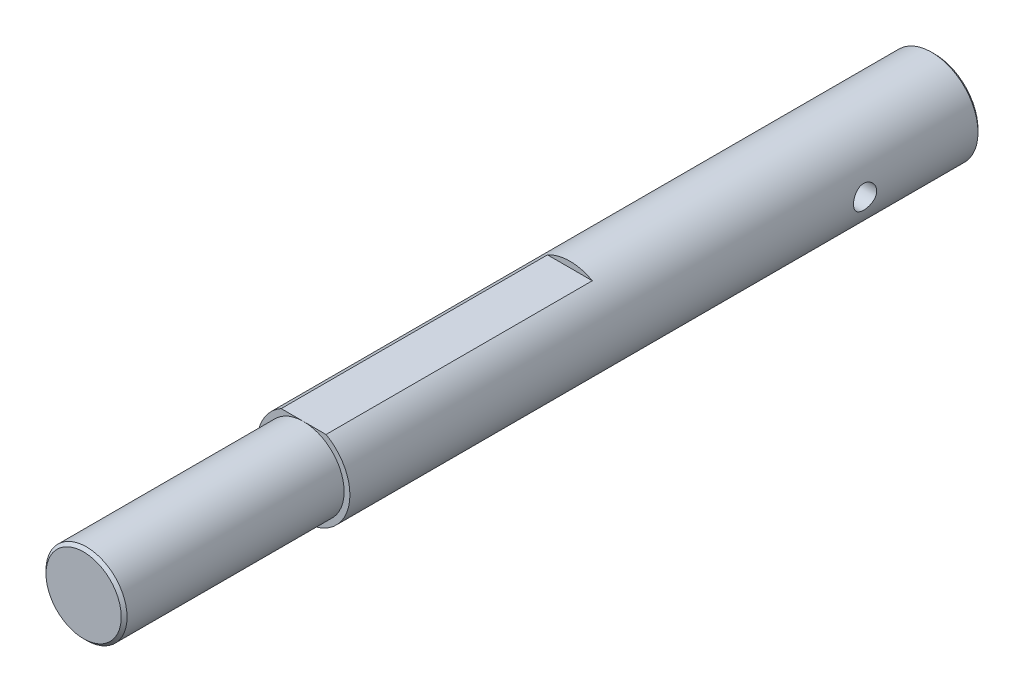
ISO-10303-21;
HEADER;
FILE_DESCRIPTION(('STEP AP214'),'2;1');
FILE_NAME('part.step','',(''),(''),'','','');
FILE_SCHEMA(('AUTOMOTIVE_DESIGN { 1 0 10303 214 1 1 1 1 }'));
ENDSEC;
DATA;
#1=APPLICATION_CONTEXT('core data for automotive mechanical design processes');
#2=APPLICATION_PROTOCOL_DEFINITION('international standard','automotive_design',2000,#1);
#3=PRODUCT_CONTEXT('',#1,'mechanical');
#4=PRODUCT('Part','Part','',(#3));
#5=PRODUCT_RELATED_PRODUCT_CATEGORY('part','',(#4));
#6=PRODUCT_DEFINITION_FORMATION('','',#4);
#7=PRODUCT_DEFINITION_CONTEXT('part definition',#1,'design');
#8=PRODUCT_DEFINITION('design','',#6,#7);
#9=PRODUCT_DEFINITION_SHAPE('','',#8);
#10=(LENGTH_UNIT() NAMED_UNIT(*) SI_UNIT(.MILLI.,.METRE.));
#11=(NAMED_UNIT(*) PLANE_ANGLE_UNIT() SI_UNIT($,.RADIAN.));
#12=(NAMED_UNIT(*) SI_UNIT($,.STERADIAN.) SOLID_ANGLE_UNIT());
#13=UNCERTAINTY_MEASURE_WITH_UNIT(LENGTH_MEASURE(1.E-05),#10,'distance_accuracy_value','');
#14=(GEOMETRIC_REPRESENTATION_CONTEXT(3) GLOBAL_UNCERTAINTY_ASSIGNED_CONTEXT((#13)) GLOBAL_UNIT_ASSIGNED_CONTEXT((#10,
#11,#12)) REPRESENTATION_CONTEXT('',''));
#15=CARTESIAN_POINT('',(0.,0.,0.));
#16=DIRECTION('',(0.,0.,1.));
#17=DIRECTION('',(1.,0.,0.));
#18=AXIS2_PLACEMENT_3D('',#15,#16,#17);
#19=CARTESIAN_POINT('',(0.,0.,77.));
#20=DIRECTION('',(0.,0.,-1.));
#21=DIRECTION('',(-1.,0.,0.));
#22=AXIS2_PLACEMENT_3D('',#19,#20,#21);
#23=PLANE('',#22);
#24=CARTESIAN_POINT('',(0.,0.,77.0000000001119));
#25=DIRECTION('',(0.,0.,-1.));
#26=DIRECTION('',(-1.,0.,0.));
#27=AXIS2_PLACEMENT_3D('',#24,#25,#26);
#28=CIRCLE('',#27,3.25000000009368);
#29=CARTESIAN_POINT('',(-3.25000000009368,0.,77.0000000001119));
#30=VERTEX_POINT('',#29);
#31=EDGE_CURVE('E20',#30,#30,#28,.T.);
#32=ORIENTED_EDGE('',*,*,#31,.F.);
#33=EDGE_LOOP('',(#32));
#34=FACE_BOUND('',#33,.T.);
#35=ADVANCED_FACE('F17',(#34),#23,.F.);
#36=CARTESIAN_POINT('',(0.,0.,76.7499999999472));
#37=DIRECTION('',(0.,0.,-1.));
#38=DIRECTION('',(-1.,0.,0.));
#39=AXIS2_PLACEMENT_3D('',#36,#37,#38);
#40=CONICAL_SURFACE('',#39,3.49999999980355,0.785398162487954);
#41=CARTESIAN_POINT('',(0.,0.,76.75));
#42=DIRECTION('',(0.,0.,1.));
#43=DIRECTION('',(1.,0.,0.));
#44=AXIS2_PLACEMENT_3D('',#41,#42,#43);
#45=CIRCLE('',#44,3.5);
#46=CARTESIAN_POINT('',(3.5,0.,76.75));
#47=VERTEX_POINT('',#46);
#48=EDGE_CURVE('E68',#47,#47,#45,.F.);
#49=ORIENTED_EDGE('',*,*,#48,.F.);
#50=EDGE_LOOP('',(#49));
#51=FACE_BOUND('',#50,.T.);
#52=ORIENTED_EDGE('',*,*,#31,.T.);
#53=EDGE_LOOP('',(#52));
#54=FACE_BOUND('',#53,.T.);
#55=ADVANCED_FACE('F112',(#51,#54),#40,.T.);
#56=CARTESIAN_POINT('',(0.,0.,58.));
#57=DIRECTION('',(0.,0.,1.));
#58=DIRECTION('',(1.,0.,0.));
#59=AXIS2_PLACEMENT_3D('',#56,#57,#58);
#60=CYLINDRICAL_SURFACE('',#59,3.5);
#61=ORIENTED_EDGE('',*,*,#48,.T.);
#62=EDGE_LOOP('',(#61));
#63=FACE_BOUND('',#62,.T.);
#64=CARTESIAN_POINT('',(0.,0.,58.));
#65=DIRECTION('',(0.,0.,1.));
#66=DIRECTION('',(1.,0.,0.));
#67=AXIS2_PLACEMENT_3D('',#64,#65,#66);
#68=CIRCLE('',#67,3.5);
#69=CARTESIAN_POINT('',(3.5,0.,58.));
#70=VERTEX_POINT('',#69);
#71=EDGE_CURVE('E71',#70,#70,#68,.F.);
#72=ORIENTED_EDGE('',*,*,#71,.F.);
#73=EDGE_LOOP('',(#72));
#74=FACE_BOUND('',#73,.T.);
#75=ADVANCED_FACE('F109',(#63,#74),#60,.T.);
#76=CARTESIAN_POINT('',(0.,0.,3.5));
#77=DIRECTION('',(0.,0.,1.));
#78=DIRECTION('',(1.,0.,0.));
#79=AXIS2_PLACEMENT_3D('',#76,#77,#78);
#80=PLANE('',#79);
#81=CARTESIAN_POINT('',(0.,0.,3.49999999986039));
#82=DIRECTION('',(0.,0.,1.));
#83=DIRECTION('',(1.,0.,0.));
#84=AXIS2_PLACEMENT_3D('',#81,#82,#83);
#85=CIRCLE('',#84,3.75000000008185);
#86=CARTESIAN_POINT('',(3.75000000008185,0.,3.49999999986039));
#87=VERTEX_POINT('',#86);
#88=EDGE_CURVE('E52',#87,#87,#85,.T.);
#89=ORIENTED_EDGE('',*,*,#88,.F.);
#90=EDGE_LOOP('',(#89));
#91=FACE_BOUND('',#90,.T.);
#92=ADVANCED_FACE('F111',(#91),#80,.F.);
#93=CARTESIAN_POINT('',(0.,0.,35.));
#94=DIRECTION('',(0.,0.,-1.));
#95=DIRECTION('',(-1.,0.,0.));
#96=AXIS2_PLACEMENT_3D('',#93,#94,#95);
#97=PLANE('',#96);
#98=CARTESIAN_POINT('',(0.,0.,35.));
#99=DIRECTION('',(0.,0.,1.));
#100=DIRECTION('',(1.,0.,0.));
#101=AXIS2_PLACEMENT_3D('',#98,#99,#100);
#102=CIRCLE('',#101,4.);
#103=CARTESIAN_POINT('',(-1.93649167310371,3.5,35.));
#104=VERTEX_POINT('',#103);
#105=CARTESIAN_POINT('',(1.93649167310371,3.5,35.));
#106=VERTEX_POINT('',#105);
#107=EDGE_CURVE('E44',#104,#106,#102,.F.);
#108=ORIENTED_EDGE('',*,*,#107,.F.);
#109=DIRECTION('',(1.,0.,0.));
#110=VECTOR('',#109,1.);
#111=CARTESIAN_POINT('',(-1.93649167310371,3.5,35.));
#112=LINE('',#111,#110);
#113=EDGE_CURVE('E47',#106,#104,#112,.F.);
#114=ORIENTED_EDGE('',*,*,#113,.F.);
#115=EDGE_LOOP('',(#108,#114));
#116=FACE_BOUND('',#115,.T.);
#117=ADVANCED_FACE('F46',(#116),#97,.F.);
#118=CARTESIAN_POINT('',(0.,0.260789753760839,58.));
#119=DIRECTION('',(0.,0.,1.));
#120=DIRECTION('',(1.,0.,0.));
#121=AXIS2_PLACEMENT_3D('',#118,#119,#120);
#122=PLANE('',#121);
#123=CARTESIAN_POINT('',(0.,0.,58.));
#124=DIRECTION('',(0.,0.,1.));
#125=DIRECTION('',(1.,0.,0.));
#126=AXIS2_PLACEMENT_3D('',#123,#124,#125);
#127=CIRCLE('',#126,4.);
#128=CARTESIAN_POINT('',(1.93649167310371,3.5,58.));
#129=VERTEX_POINT('',#128);
#130=CARTESIAN_POINT('',(-1.93649167310371,3.5,58.));
#131=VERTEX_POINT('',#130);
#132=EDGE_CURVE('E59',#129,#131,#127,.F.);
#133=ORIENTED_EDGE('',*,*,#132,.F.);
#134=DIRECTION('',(1.,0.,0.));
#135=VECTOR('',#134,1.);
#136=CARTESIAN_POINT('',(-1.93649167310371,3.5,58.));
#137=LINE('',#136,#135);
#138=EDGE_CURVE('E32',#131,#129,#137,.T.);
#139=ORIENTED_EDGE('',*,*,#138,.F.);
#140=EDGE_LOOP('',(#133,#139));
#141=FACE_BOUND('',#140,.T.);
#142=ORIENTED_EDGE('',*,*,#71,.T.);
#143=EDGE_LOOP('',(#142));
#144=FACE_BOUND('',#143,.T.);
#145=ADVANCED_FACE('F107',(#141,#144),#122,.T.);
#146=CARTESIAN_POINT('',(-1.93649167310371,3.5,35.));
#147=DIRECTION('',(0.,1.,0.));
#148=DIRECTION('',(0.,0.,1.));
#149=AXIS2_PLACEMENT_3D('',#146,#147,#148);
#150=PLANE('',#149);
#151=ORIENTED_EDGE('',*,*,#113,.T.);
#152=DIRECTION('',(0.,0.,1.));
#153=VECTOR('',#152,1.);
#154=CARTESIAN_POINT('',(-1.93649167310371,3.5,0.));
#155=LINE('',#154,#153);
#156=EDGE_CURVE('E55',#131,#104,#155,.F.);
#157=ORIENTED_EDGE('',*,*,#156,.F.);
#158=ORIENTED_EDGE('',*,*,#138,.T.);
#159=DIRECTION('',(0.,0.,1.));
#160=VECTOR('',#159,1.);
#161=CARTESIAN_POINT('',(1.93649167310371,3.5,0.));
#162=LINE('',#161,#160);
#163=EDGE_CURVE('E51',#106,#129,#162,.T.);
#164=ORIENTED_EDGE('',*,*,#163,.F.);
#165=EDGE_LOOP('',(#151,#157,#158,#164));
#166=FACE_BOUND('',#165,.T.);
#167=ADVANCED_FACE('F54',(#166),#150,.T.);
#168=CARTESIAN_POINT('',(0.,0.,13.5));
#169=DIRECTION('',(1.,0.,0.));
#170=DIRECTION('',(0.,0.,-1.));
#171=AXIS2_PLACEMENT_3D('',#168,#169,#170);
#172=CYLINDRICAL_SURFACE('',#171,1.);
#173=CARTESIAN_POINT('',(-3.87298334620742,0.999999999999999,13.5));
#174=CARTESIAN_POINT('',(-3.87298440057185,0.999998431438698,13.5552203003568));
#175=CARTESIAN_POINT('',(-3.87417722499279,0.995410498208068,13.6104579594314));
#176=CARTESIAN_POINT('',(-3.87880744892249,0.977209250194445,13.7193470312326));
#177=CARTESIAN_POINT('',(-3.88224615474181,0.963590682698076,13.77299750178));
#178=CARTESIAN_POINT('',(-3.89095489813012,0.927796479849634,13.8771214152878));
#179=CARTESIAN_POINT('',(-3.8962225706936,0.905631891140943,13.9275988621578));
#180=CARTESIAN_POINT('',(-3.90799276818327,0.853408456505406,14.0241243410125));
#181=CARTESIAN_POINT('',(-3.91449534553241,0.823349275424504,14.0701721848311));
#182=CARTESIAN_POINT('',(-3.92816286540368,0.755483370924516,14.1575446581058));
#183=CARTESIAN_POINT('',(-3.93533839048709,0.717534755081557,14.1987574401403));
#184=CARTESIAN_POINT('',(-3.94945150206622,0.635272825640328,14.2743045577439));
#185=CARTESIAN_POINT('',(-3.95638906626692,0.590958917672139,14.3086382502486));
#186=CARTESIAN_POINT('',(-3.96936166208095,0.496458080431564,14.3699101870526));
#187=CARTESIAN_POINT('',(-3.975382749602,0.446197830478043,14.3967385552646));
#188=CARTESIAN_POINT('',(-3.98572324770431,0.341705273717108,14.4415238576612));
#189=CARTESIAN_POINT('',(-3.99004290933748,0.287473554316776,14.4594821007662));
#190=CARTESIAN_POINT('',(-3.99641903539263,0.177743503501662,14.4856591338314));
#191=CARTESIAN_POINT('',(-3.99851957537723,0.122293087819588,14.4940678577306));
#192=CARTESIAN_POINT('',(-4.00037437642922,0.0107315277051069,14.5015033517102));
#193=CARTESIAN_POINT('',(-4.00012898438682,-0.0453795178152283,14.5005315088838));
#194=CARTESIAN_POINT('',(-3.99735237981413,-0.155352247172388,14.4893700598999));
#195=CARTESIAN_POINT('',(-3.9948720093635,-0.209236215601068,14.4793854699785));
#196=CARTESIAN_POINT('',(-3.98796334609942,-0.314538247413687,14.4508114919806));
#197=CARTESIAN_POINT('',(-3.98353494959377,-0.365956179370439,14.432221645849));
#198=CARTESIAN_POINT('',(-3.97315003880358,-0.465406703501807,14.3867989717252));
#199=CARTESIAN_POINT('',(-3.96718007878022,-0.513404509766505,14.3598931821353));
#200=CARTESIAN_POINT('',(-3.9543596152386,-0.604275622340489,14.2986577283535));
#201=CARTESIAN_POINT('',(-3.94750895860996,-0.647148035085506,14.2643267725757));
#202=CARTESIAN_POINT('',(-3.93345485507808,-0.727774035084957,14.188116503207));
#203=CARTESIAN_POINT('',(-3.92624687810367,-0.7653576790752,14.1460580430609));
#204=CARTESIAN_POINT('',(-3.91246017406683,-0.832976375963019,14.0561600105839));
#205=CARTESIAN_POINT('',(-3.90588147642388,-0.863011076046017,14.0083201682036));
#206=CARTESIAN_POINT('',(-3.8940819873266,-0.914788129022598,13.9078839863404));
#207=CARTESIAN_POINT('',(-3.88886793490288,-0.936489566970491,13.8552657078747));
#208=CARTESIAN_POINT('',(-3.88047456055983,-0.970685620636341,13.7469658127694));
#209=CARTESIAN_POINT('',(-3.87729480324088,-0.98318220655291,13.6912848544067));
#210=CARTESIAN_POINT('',(-3.87342142415656,-0.998331855466071,13.5800161993907));
#211=CARTESIAN_POINT('',(-3.87266435637459,-1.00123618956785,13.5244648826681));
#212=CARTESIAN_POINT('',(-3.87354937392416,-0.997806796206219,13.4136712253687));
#213=CARTESIAN_POINT('',(-3.87519123840507,-0.99147391913952,13.3584288568195));
#214=CARTESIAN_POINT('',(-3.88062832781824,-0.969970185575065,13.2507542940181));
#215=CARTESIAN_POINT('',(-3.8843878809375,-0.954945627312699,13.1982909093717));
#216=CARTESIAN_POINT('',(-3.89360287308385,-0.916647232668249,13.0966274168593));
#217=CARTESIAN_POINT('',(-3.89905851299446,-0.893372419085018,13.0474276963779));
#218=CARTESIAN_POINT('',(-3.91118454837305,-0.838708267174623,12.9526234888531));
#219=CARTESIAN_POINT('',(-3.91787667442657,-0.807168701534252,12.9071084639828));
#220=CARTESIAN_POINT('',(-3.93166833228686,-0.737060292934455,12.8219246548795));
#221=CARTESIAN_POINT('',(-3.93876793091388,-0.698490294805438,12.78225683334));
#222=CARTESIAN_POINT('',(-3.95278961212643,-0.614262720984724,12.7088755829716));
#223=CARTESIAN_POINT('',(-3.95970280824734,-0.568451952531591,12.6753359749805));
#224=CARTESIAN_POINT('',(-3.97238886645494,-0.471702682694675,12.6164256532195));
#225=CARTESIAN_POINT('',(-3.97816178801584,-0.420764448957591,12.5910545133567));
#226=CARTESIAN_POINT('',(-3.98788046295326,-0.31555820173109,12.5494215861888));
#227=CARTESIAN_POINT('',(-3.99183932008964,-0.261317381027881,12.5330942862484));
#228=CARTESIAN_POINT('',(-3.99754117358315,-0.150749760318808,12.5098158661566));
#229=CARTESIAN_POINT('',(-3.99928459757364,-0.0944233650412438,12.5028629365044));
#230=CARTESIAN_POINT('',(-4.00034169408811,0.0170835264433256,12.4986324104245));
#231=CARTESIAN_POINT('',(-3.99971978880009,0.0722538269660323,12.5010982909046));
#232=CARTESIAN_POINT('',(-3.99625896457424,0.181367496414739,12.5150478272943));
#233=CARTESIAN_POINT('',(-3.99342011157095,0.235310901780886,12.5265312150131));
#234=CARTESIAN_POINT('',(-3.98585432853963,0.340171035644816,12.5580522197709));
#235=CARTESIAN_POINT('',(-3.98113764502669,0.391102494581019,12.5780434533146));
#236=CARTESIAN_POINT('',(-3.97031288913382,0.488917053041468,12.6259705790193));
#237=CARTESIAN_POINT('',(-3.96420464137727,0.535799641265051,12.6539074726696));
#238=CARTESIAN_POINT('',(-3.95107249681343,0.6254019284239,12.7177152339971));
#239=CARTESIAN_POINT('',(-3.94403016945647,0.667994988300587,12.7537601429074));
#240=CARTESIAN_POINT('',(-3.92990649053207,0.746615020271251,12.8324228519738));
#241=CARTESIAN_POINT('',(-3.92282512952424,0.782640325068178,12.8750423160979));
#242=CARTESIAN_POINT('',(-3.90927475860683,0.84776202647924,12.9666014142013));
#243=CARTESIAN_POINT('',(-3.90281963730391,0.876716619446593,13.0156441234125));
#244=CARTESIAN_POINT('',(-3.8914395555011,0.925926896615622,13.1180554899228));
#245=CARTESIAN_POINT('',(-3.88651348244814,0.946188909759556,13.1714209661073));
#246=CARTESIAN_POINT('',(-3.87951908741315,0.974422528565571,13.2705770118263));
#247=CARTESIAN_POINT('',(-3.87708663005761,0.983993170595828,13.3158931643824));
#248=CARTESIAN_POINT('',(-3.87381838580358,0.996782292572819,13.4074688690015));
#249=CARTESIAN_POINT('',(-3.87298246270639,1.00000131437052,13.4537283402506));
#250=CARTESIAN_POINT('',(-3.87298334620742,0.999999999999999,13.5));
#251=B_SPLINE_CURVE_WITH_KNOTS('',3,(#173,#174,#175,#176,#177,#178,#179,#180,#181,#182,#183,
#184,#185,#186,#187,#188,#189,#190,#191,#192,#193,#194,#195,#196,#197,#198,#199,#200,#201,#202,
#203,#204,#205,#206,#207,#208,#209,#210,#211,#212,#213,#214,#215,#216,#217,#218,#219,#220,#221,
#222,#223,#224,#225,#226,#227,#228,#229,#230,#231,#232,#233,#234,#235,#236,#237,#238,#239,#240,
#241,#242,#243,#244,#245,#246,#247,#248,#249,#250),.UNSPECIFIED.,.T.,.F.,(4,2,2,2,2,2,2,2,2,2,2,
2,2,2,2,2,2,2,2,2,2,2,2,2,2,2,2,2,2,2,2,2,2,2,2,2,2,2,4),(0.,0.165490976675229,0.33107829653421,
0.496452290829151,0.661833306984657,0.830495816734647,0.999174085882208,1.17020598555442,
1.34121263935111,1.50875500394413,1.67627259462682,1.84007305071853,2.00388222686189,
2.16917149698052,2.3344895418384,2.50428186625039,2.67408212476195,2.84470572799635,
3.01529280048093,3.18137429900961,3.34744050869795,3.51078961999957,3.67415808564841,
3.84073138339937,4.00733207550292,4.17810132382402,4.34886166284096,4.51836829119046,
4.6878421955989,4.85273378447257,5.01762046947067,5.18161950620159,5.34563922291503,
5.51358838629103,5.68158012622478,5.85270590910146,6.02370688542922,6.16239130867206,
6.30106390036083),.UNSPECIFIED.);
#252=CARTESIAN_POINT('',(-3.87298334620742,0.999999999999999,13.5));
#253=VERTEX_POINT('',#252);
#254=EDGE_CURVE('E60',#253,#253,#251,.T.);
#255=ORIENTED_EDGE('',*,*,#254,.F.);
#256=EDGE_LOOP('',(#255));
#257=FACE_BOUND('',#256,.T.);
#258=CARTESIAN_POINT('',(3.87298334620742,0.999999999999999,13.5));
#259=CARTESIAN_POINT('',(3.87298440057185,0.999998431438698,13.4447796996432));
#260=CARTESIAN_POINT('',(3.87417722499279,0.995410498208068,13.3895420405686));
#261=CARTESIAN_POINT('',(3.87880744892249,0.977209250194445,13.2806529687674));
#262=CARTESIAN_POINT('',(3.88224615474181,0.963590682698077,13.22700249822));
#263=CARTESIAN_POINT('',(3.89095489813012,0.927796479849635,13.1228785847122));
#264=CARTESIAN_POINT('',(3.8962225706936,0.905631891140944,13.0724011378422));
#265=CARTESIAN_POINT('',(3.90799276818327,0.853408456505407,12.9758756589875));
#266=CARTESIAN_POINT('',(3.91449534553241,0.823349275424505,12.9298278151689));
#267=CARTESIAN_POINT('',(3.92816286540368,0.755483370924517,12.8424553418942));
#268=CARTESIAN_POINT('',(3.93533839048709,0.717534755081558,12.8012425598597));
#269=CARTESIAN_POINT('',(3.94945150206622,0.635272825640328,12.7256954422561));
#270=CARTESIAN_POINT('',(3.95638906626692,0.59095891767214,12.6913617497514));
#271=CARTESIAN_POINT('',(3.96936166208095,0.496458080431565,12.6300898129474));
#272=CARTESIAN_POINT('',(3.975382749602,0.446197830478043,12.6032614447354));
#273=CARTESIAN_POINT('',(3.98572324770431,0.341705273717109,12.5584761423388));
#274=CARTESIAN_POINT('',(3.99004290933748,0.287473554316777,12.5405178992338));
#275=CARTESIAN_POINT('',(3.99641903539263,0.177743503501663,12.5143408661686));
#276=CARTESIAN_POINT('',(3.99851957537723,0.12229308781959,12.5059321422694));
#277=CARTESIAN_POINT('',(4.00037437642922,0.0107315277051086,12.4984966482898));
#278=CARTESIAN_POINT('',(4.00012898438682,-0.0453795178152267,12.4994684911162));
#279=CARTESIAN_POINT('',(3.99735237981413,-0.155352247172387,12.5106299401001));
#280=CARTESIAN_POINT('',(3.9948720093635,-0.209236215601067,12.5206145300215));
#281=CARTESIAN_POINT('',(3.98796334609942,-0.314538247413686,12.5491885080194));
#282=CARTESIAN_POINT('',(3.98353494959377,-0.365956179370438,12.567778354151));
#283=CARTESIAN_POINT('',(3.97315003880358,-0.465406703501806,12.6132010282748));
#284=CARTESIAN_POINT('',(3.96718007878022,-0.513404509766504,12.6401068178647));
#285=CARTESIAN_POINT('',(3.9543596152386,-0.604275622340488,12.7013422716465));
#286=CARTESIAN_POINT('',(3.94750895860996,-0.647148035085505,12.7356732274242));
#287=CARTESIAN_POINT('',(3.93345485507808,-0.727774035084956,12.8118834967929));
#288=CARTESIAN_POINT('',(3.92624687810367,-0.765357679075199,12.8539419569391));
#289=CARTESIAN_POINT('',(3.91246017406683,-0.832976375963019,12.9438399894161));
#290=CARTESIAN_POINT('',(3.90588147642388,-0.863011076046017,12.9916798317964));
#291=CARTESIAN_POINT('',(3.89408198732659,-0.914788129022598,13.0921160136596));
#292=CARTESIAN_POINT('',(3.88886793490288,-0.936489566970491,13.1447342921253));
#293=CARTESIAN_POINT('',(3.88047456055983,-0.970685620636341,13.2530341872306));
#294=CARTESIAN_POINT('',(3.87729480324088,-0.98318220655291,13.3087151455932));
#295=CARTESIAN_POINT('',(3.87342142415656,-0.998331855466071,13.4199838006092));
#296=CARTESIAN_POINT('',(3.87266435637459,-1.00123618956785,13.4755351173318));
#297=CARTESIAN_POINT('',(3.87354937392416,-0.99780679620622,13.5863287746313));
#298=CARTESIAN_POINT('',(3.87519123840507,-0.991473919139521,13.6415711431805));
#299=CARTESIAN_POINT('',(3.88062832781824,-0.969970185575066,13.7492457059819));
#300=CARTESIAN_POINT('',(3.8843878809375,-0.954945627312699,13.8017090906283));
#301=CARTESIAN_POINT('',(3.89360287308385,-0.916647232668249,13.9033725831407));
#302=CARTESIAN_POINT('',(3.89905851299446,-0.893372419085019,13.9525723036221));
#303=CARTESIAN_POINT('',(3.91118454837305,-0.838708267174624,14.0473765111469));
#304=CARTESIAN_POINT('',(3.91787667442657,-0.807168701534252,14.0928915360172));
#305=CARTESIAN_POINT('',(3.93166833228686,-0.737060292934457,14.1780753451205));
#306=CARTESIAN_POINT('',(3.93876793091388,-0.69849029480544,14.21774316666));
#307=CARTESIAN_POINT('',(3.95278961212643,-0.614262720984726,14.2911244170284));
#308=CARTESIAN_POINT('',(3.95970280824734,-0.568451952531594,14.3246640250195));
#309=CARTESIAN_POINT('',(3.97238886645494,-0.471702682694677,14.3835743467805));
#310=CARTESIAN_POINT('',(3.97816178801584,-0.420764448957593,14.4089454866433));
#311=CARTESIAN_POINT('',(3.98788046295326,-0.315558201731092,14.4505784138112));
#312=CARTESIAN_POINT('',(3.99183932008964,-0.261317381027883,14.4669057137516));
#313=CARTESIAN_POINT('',(3.99754117358315,-0.15074976031881,14.4901841338434));
#314=CARTESIAN_POINT('',(3.99928459757364,-0.0944233650412459,14.4971370634956));
#315=CARTESIAN_POINT('',(4.00034169408811,0.0170835264433242,14.5013675895755));
#316=CARTESIAN_POINT('',(3.99971978880009,0.0722538269660311,14.4989017090954));
#317=CARTESIAN_POINT('',(3.99625896457424,0.181367496414738,14.4849521727057));
#318=CARTESIAN_POINT('',(3.99342011157095,0.235310901780885,14.4734687849869));
#319=CARTESIAN_POINT('',(3.98585432853964,0.340171035644814,14.4419477802291));
#320=CARTESIAN_POINT('',(3.98113764502669,0.391102494581017,14.4219565466854));
#321=CARTESIAN_POINT('',(3.97031288913382,0.488917053041467,14.3740294209807));
#322=CARTESIAN_POINT('',(3.96420464137727,0.535799641265049,14.3460925273304));
#323=CARTESIAN_POINT('',(3.95107249681343,0.625401928423898,14.2822847660029));
#324=CARTESIAN_POINT('',(3.94403016945647,0.667994988300584,14.2462398570926));
#325=CARTESIAN_POINT('',(3.92990649053207,0.746615020271249,14.1675771480262));
#326=CARTESIAN_POINT('',(3.92282512952424,0.782640325068176,14.1249576839021));
#327=CARTESIAN_POINT('',(3.90927475860683,0.847762026479238,14.0333985857987));
#328=CARTESIAN_POINT('',(3.90281963730391,0.876716619446591,13.9843558765875));
#329=CARTESIAN_POINT('',(3.8914395555011,0.92592689661562,13.8819445100772));
#330=CARTESIAN_POINT('',(3.88651348244815,0.946188909759555,13.8285790338927));
#331=CARTESIAN_POINT('',(3.87951908741315,0.97442252856557,13.7294229881737));
#332=CARTESIAN_POINT('',(3.87708663005761,0.983993170595828,13.6841068356176));
#333=CARTESIAN_POINT('',(3.87381838580358,0.996782292572818,13.5925311309985));
#334=CARTESIAN_POINT('',(3.87298246270639,1.00000131437052,13.5462716597494));
#335=CARTESIAN_POINT('',(3.87298334620742,0.999999999999999,13.5));
#336=B_SPLINE_CURVE_WITH_KNOTS('',3,(#258,#259,#260,#261,#262,#263,#264,#265,#266,#267,#268,
#269,#270,#271,#272,#273,#274,#275,#276,#277,#278,#279,#280,#281,#282,#283,#284,#285,#286,#287,
#288,#289,#290,#291,#292,#293,#294,#295,#296,#297,#298,#299,#300,#301,#302,#303,#304,#305,#306,
#307,#308,#309,#310,#311,#312,#313,#314,#315,#316,#317,#318,#319,#320,#321,#322,#323,#324,#325,
#326,#327,#328,#329,#330,#331,#332,#333,#334,#335),.UNSPECIFIED.,.T.,.F.,(4,2,2,2,2,2,2,2,2,2,2,
2,2,2,2,2,2,2,2,2,2,2,2,2,2,2,2,2,2,2,2,2,2,2,2,2,2,2,4),(0.,0.165490976675229,0.33107829653421,
0.496452290829151,0.661833306984657,0.830495816734648,0.99917408588221,1.17020598555442,
1.34121263935111,1.50875500394413,1.67627259462682,1.84007305071853,2.00388222686189,
2.16917149698052,2.3344895418384,2.50428186625039,2.67408212476195,2.84470572799635,
3.01529280048093,3.18137429900961,3.34744050869795,3.51078961999957,3.67415808564841,
3.84073138339937,4.00733207550292,4.17810132382402,4.34886166284096,4.51836829119046,
4.6878421955989,4.85273378447257,5.01762046947067,5.18161950620159,5.34563922291503,
5.51358838629102,5.68158012622478,5.85270590910145,6.02370688542922,6.16239130867206,
6.30106390036083),.UNSPECIFIED.);
#337=CARTESIAN_POINT('',(3.87298334620742,0.999999999999999,13.5));
#338=VERTEX_POINT('',#337);
#339=EDGE_CURVE('E25',#338,#338,#336,.T.);
#340=ORIENTED_EDGE('',*,*,#339,.F.);
#341=EDGE_LOOP('',(#340));
#342=FACE_BOUND('',#341,.T.);
#343=ADVANCED_FACE('F81',(#257,#342),#172,.F.);
#344=CARTESIAN_POINT('',(0.,0.,3.75000000008185));
#345=DIRECTION('',(0.,0.,1.));
#346=DIRECTION('',(1.,0.,0.));
#347=AXIS2_PLACEMENT_3D('',#344,#345,#346);
#348=CONICAL_SURFACE('',#347,3.99999999984857,0.785398162487954);
#349=CARTESIAN_POINT('',(0.,0.,3.75));
#350=DIRECTION('',(0.,0.,1.));
#351=DIRECTION('',(1.,0.,0.));
#352=AXIS2_PLACEMENT_3D('',#349,#350,#351);
#353=CIRCLE('',#352,4.);
#354=CARTESIAN_POINT('',(4.,0.,3.75));
#355=VERTEX_POINT('',#354);
#356=EDGE_CURVE('E11',#355,#355,#353,.T.);
#357=ORIENTED_EDGE('',*,*,#356,.F.);
#358=EDGE_LOOP('',(#357));
#359=FACE_BOUND('',#358,.T.);
#360=ORIENTED_EDGE('',*,*,#88,.T.);
#361=EDGE_LOOP('',(#360));
#362=FACE_BOUND('',#361,.T.);
#363=ADVANCED_FACE('F87',(#359,#362),#348,.T.);
#364=CARTESIAN_POINT('',(0.,0.,0.));
#365=DIRECTION('',(0.,0.,1.));
#366=DIRECTION('',(1.,0.,0.));
#367=AXIS2_PLACEMENT_3D('',#364,#365,#366);
#368=CYLINDRICAL_SURFACE('',#367,4.);
#369=ORIENTED_EDGE('',*,*,#356,.T.);
#370=EDGE_LOOP('',(#369));
#371=FACE_BOUND('',#370,.T.);
#372=ORIENTED_EDGE('',*,*,#339,.T.);
#373=EDGE_LOOP('',(#372));
#374=FACE_BOUND('',#373,.T.);
#375=ORIENTED_EDGE('',*,*,#254,.T.);
#376=EDGE_LOOP('',(#375));
#377=FACE_BOUND('',#376,.T.);
#378=ORIENTED_EDGE('',*,*,#132,.T.);
#379=ORIENTED_EDGE('',*,*,#156,.T.);
#380=ORIENTED_EDGE('',*,*,#107,.T.);
#381=ORIENTED_EDGE('',*,*,#163,.T.);
#382=EDGE_LOOP('',(#378,#379,#380,#381));
#383=FACE_BOUND('',#382,.T.);
#384=ADVANCED_FACE('F58',(#371,#374,#377,#383),#368,.T.);
#385=CLOSED_SHELL('',(#35,#55,#75,#92,#117,#145,#167,#343,#363,#384));
#386=MANIFOLD_SOLID_BREP('B1',#385);
#387=ADVANCED_BREP_SHAPE_REPRESENTATION('',(#18,#386),#14);
#388=SHAPE_DEFINITION_REPRESENTATION(#9,#387);
ENDSEC;
END-ISO-10303-21;
